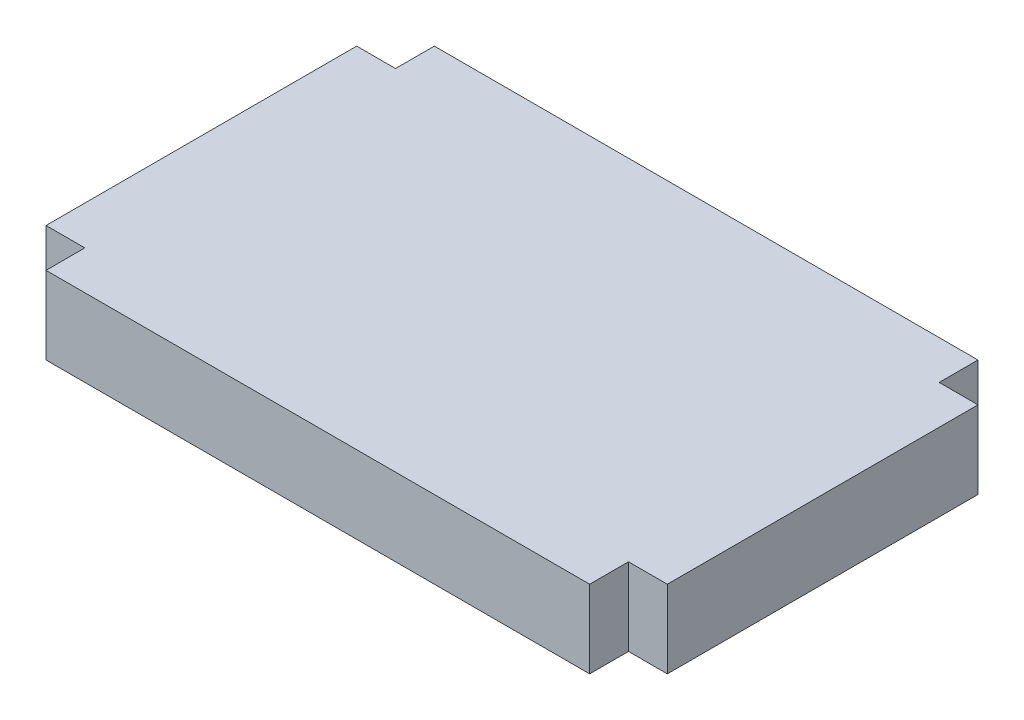
ISO-10303-21;
HEADER;
FILE_DESCRIPTION(('STEP AP214'),'2;1');
FILE_NAME('part.step','',(''),(''),'','','');
FILE_SCHEMA(('AUTOMOTIVE_DESIGN { 1 0 10303 214 1 1 1 1 }'));
ENDSEC;
DATA;
#1=APPLICATION_CONTEXT('core data for automotive mechanical design processes');
#2=APPLICATION_PROTOCOL_DEFINITION('international standard','automotive_design',2000,#1);
#3=PRODUCT_CONTEXT('',#1,'mechanical');
#4=PRODUCT('Part','Part','',(#3));
#5=PRODUCT_RELATED_PRODUCT_CATEGORY('part','',(#4));
#6=PRODUCT_DEFINITION_FORMATION('','',#4);
#7=PRODUCT_DEFINITION_CONTEXT('part definition',#1,'design');
#8=PRODUCT_DEFINITION('design','',#6,#7);
#9=PRODUCT_DEFINITION_SHAPE('','',#8);
#10=(LENGTH_UNIT() NAMED_UNIT(*) SI_UNIT(.MILLI.,.METRE.));
#11=(NAMED_UNIT(*) PLANE_ANGLE_UNIT() SI_UNIT($,.RADIAN.));
#12=(NAMED_UNIT(*) SI_UNIT($,.STERADIAN.) SOLID_ANGLE_UNIT());
#13=UNCERTAINTY_MEASURE_WITH_UNIT(LENGTH_MEASURE(1.E-05),#10,'distance_accuracy_value','');
#14=(GEOMETRIC_REPRESENTATION_CONTEXT(3) GLOBAL_UNCERTAINTY_ASSIGNED_CONTEXT((#13)) GLOBAL_UNIT_ASSIGNED_CONTEXT((#10,
#11,#12)) REPRESENTATION_CONTEXT('',''));
#15=CARTESIAN_POINT('',(0.,0.,0.));
#16=DIRECTION('',(0.,0.,1.));
#17=DIRECTION('',(1.,0.,0.));
#18=AXIS2_PLACEMENT_3D('',#15,#16,#17);
#19=CARTESIAN_POINT('',(22.225,6.35,12.7));
#20=DIRECTION('',(0.,0.,-1.));
#21=DIRECTION('',(-1.,0.,0.));
#22=AXIS2_PLACEMENT_3D('',#19,#20,#21);
#23=PLANE('',#22);
#24=DIRECTION('',(1.,0.,0.));
#25=VECTOR('',#24,1.);
#26=CARTESIAN_POINT('',(22.225,0.,12.7));
#27=LINE('',#26,#25);
#28=CARTESIAN_POINT('',(22.225,0.,12.7));
#29=VERTEX_POINT('',#28);
#30=CARTESIAN_POINT('',(25.4,0.,12.7));
#31=VERTEX_POINT('',#30);
#32=EDGE_CURVE('E164',#29,#31,#27,.T.);
#33=ORIENTED_EDGE('',*,*,#32,.T.);
#34=DIRECTION('',(0.,-1.,0.));
#35=VECTOR('',#34,1.);
#36=CARTESIAN_POINT('',(25.4,6.35,12.7));
#37=LINE('',#36,#35);
#38=CARTESIAN_POINT('',(25.4,6.35,12.7));
#39=VERTEX_POINT('',#38);
#40=EDGE_CURVE('E11',#39,#31,#37,.T.);
#41=ORIENTED_EDGE('',*,*,#40,.F.);
#42=DIRECTION('',(1.,0.,0.));
#43=VECTOR('',#42,1.);
#44=CARTESIAN_POINT('',(22.225,6.35,12.7));
#45=LINE('',#44,#43);
#46=CARTESIAN_POINT('',(22.225,6.35,12.7));
#47=VERTEX_POINT('',#46);
#48=EDGE_CURVE('E198',#47,#39,#45,.T.);
#49=ORIENTED_EDGE('',*,*,#48,.F.);
#50=DIRECTION('',(0.,-1.,0.));
#51=VECTOR('',#50,1.);
#52=CARTESIAN_POINT('',(22.225,6.35,12.7));
#53=LINE('',#52,#51);
#54=EDGE_CURVE('E160',#47,#29,#53,.T.);
#55=ORIENTED_EDGE('',*,*,#54,.T.);
#56=EDGE_LOOP('',(#33,#41,#49,#55));
#57=FACE_BOUND('',#56,.T.);
#58=ADVANCED_FACE('F39',(#57),#23,.F.);
#59=CARTESIAN_POINT('',(25.4,6.35,-12.7));
#60=DIRECTION('',(-1.,0.,0.));
#61=DIRECTION('',(0.,0.,1.));
#62=AXIS2_PLACEMENT_3D('',#59,#60,#61);
#63=PLANE('',#62);
#64=DIRECTION('',(0.,0.,-1.));
#65=VECTOR('',#64,1.);
#66=CARTESIAN_POINT('',(25.4,0.,-12.7));
#67=LINE('',#66,#65);
#68=CARTESIAN_POINT('',(25.4,0.,-12.7));
#69=VERTEX_POINT('',#68);
#70=EDGE_CURVE('E168',#31,#69,#67,.T.);
#71=ORIENTED_EDGE('',*,*,#70,.T.);
#72=DIRECTION('',(0.,-1.,0.));
#73=VECTOR('',#72,1.);
#74=CARTESIAN_POINT('',(25.4,6.35,-12.7));
#75=LINE('',#74,#73);
#76=CARTESIAN_POINT('',(25.4,6.35,-12.7));
#77=VERTEX_POINT('',#76);
#78=EDGE_CURVE('E48',#77,#69,#75,.T.);
#79=ORIENTED_EDGE('',*,*,#78,.F.);
#80=DIRECTION('',(0.,0.,-1.));
#81=VECTOR('',#80,1.);
#82=CARTESIAN_POINT('',(25.4,6.35,-12.7));
#83=LINE('',#82,#81);
#84=EDGE_CURVE('E111',#39,#77,#83,.T.);
#85=ORIENTED_EDGE('',*,*,#84,.F.);
#86=ORIENTED_EDGE('',*,*,#40,.T.);
#87=EDGE_LOOP('',(#71,#79,#85,#86));
#88=FACE_BOUND('',#87,.T.);
#89=ADVANCED_FACE('F292',(#88),#63,.F.);
#90=CARTESIAN_POINT('',(22.225,6.35,-12.7));
#91=DIRECTION('',(0.,0.,1.));
#92=DIRECTION('',(1.,0.,0.));
#93=AXIS2_PLACEMENT_3D('',#90,#91,#92);
#94=PLANE('',#93);
#95=DIRECTION('',(-1.,0.,0.));
#96=VECTOR('',#95,1.);
#97=CARTESIAN_POINT('',(22.225,0.,-12.7));
#98=LINE('',#97,#96);
#99=CARTESIAN_POINT('',(22.225,0.,-12.7));
#100=VERTEX_POINT('',#99);
#101=EDGE_CURVE('E171',#69,#100,#98,.T.);
#102=ORIENTED_EDGE('',*,*,#101,.T.);
#103=DIRECTION('',(0.,-1.,0.));
#104=VECTOR('',#103,1.);
#105=CARTESIAN_POINT('',(22.225,6.35,-12.7));
#106=LINE('',#105,#104);
#107=CARTESIAN_POINT('',(22.225,6.35,-12.7));
#108=VERTEX_POINT('',#107);
#109=EDGE_CURVE('E225',#108,#100,#106,.T.);
#110=ORIENTED_EDGE('',*,*,#109,.F.);
#111=DIRECTION('',(-1.,0.,0.));
#112=VECTOR('',#111,1.);
#113=CARTESIAN_POINT('',(22.225,6.35,-12.7));
#114=LINE('',#113,#112);
#115=EDGE_CURVE('E235',#77,#108,#114,.T.);
#116=ORIENTED_EDGE('',*,*,#115,.F.);
#117=ORIENTED_EDGE('',*,*,#78,.T.);
#118=EDGE_LOOP('',(#102,#110,#116,#117));
#119=FACE_BOUND('',#118,.T.);
#120=ADVANCED_FACE('F233',(#119),#94,.F.);
#121=CARTESIAN_POINT('',(22.225,6.35,-15.875));
#122=DIRECTION('',(-1.,0.,0.));
#123=DIRECTION('',(0.,0.,1.));
#124=AXIS2_PLACEMENT_3D('',#121,#122,#123);
#125=PLANE('',#124);
#126=DIRECTION('',(0.,0.,-1.));
#127=VECTOR('',#126,1.);
#128=CARTESIAN_POINT('',(22.225,0.,-15.875));
#129=LINE('',#128,#127);
#130=CARTESIAN_POINT('',(22.225,0.,-15.875));
#131=VERTEX_POINT('',#130);
#132=EDGE_CURVE('E174',#100,#131,#129,.T.);
#133=ORIENTED_EDGE('',*,*,#132,.T.);
#134=DIRECTION('',(0.,-1.,0.));
#135=VECTOR('',#134,1.);
#136=CARTESIAN_POINT('',(22.225,6.35,-15.875));
#137=LINE('',#136,#135);
#138=CARTESIAN_POINT('',(22.225,6.35,-15.875));
#139=VERTEX_POINT('',#138);
#140=EDGE_CURVE('E221',#139,#131,#137,.T.);
#141=ORIENTED_EDGE('',*,*,#140,.F.);
#142=DIRECTION('',(0.,0.,-1.));
#143=VECTOR('',#142,1.);
#144=CARTESIAN_POINT('',(22.225,6.35,-15.875));
#145=LINE('',#144,#143);
#146=EDGE_CURVE('E254',#108,#139,#145,.T.);
#147=ORIENTED_EDGE('',*,*,#146,.F.);
#148=ORIENTED_EDGE('',*,*,#109,.T.);
#149=EDGE_LOOP('',(#133,#141,#147,#148));
#150=FACE_BOUND('',#149,.T.);
#151=ADVANCED_FACE('F244',(#150),#125,.F.);
#152=CARTESIAN_POINT('',(-22.225,6.35,-15.875));
#153=DIRECTION('',(0.,0.,1.));
#154=DIRECTION('',(1.,0.,0.));
#155=AXIS2_PLACEMENT_3D('',#152,#153,#154);
#156=PLANE('',#155);
#157=DIRECTION('',(-1.,0.,0.));
#158=VECTOR('',#157,1.);
#159=CARTESIAN_POINT('',(-22.225,0.,-15.875));
#160=LINE('',#159,#158);
#161=CARTESIAN_POINT('',(-22.225,0.,-15.875));
#162=VERTEX_POINT('',#161);
#163=EDGE_CURVE('E177',#131,#162,#160,.T.);
#164=ORIENTED_EDGE('',*,*,#163,.T.);
#165=DIRECTION('',(0.,-1.,0.));
#166=VECTOR('',#165,1.);
#167=CARTESIAN_POINT('',(-22.225,6.35,-15.875));
#168=LINE('',#167,#166);
#169=CARTESIAN_POINT('',(-22.225,6.35,-15.875));
#170=VERTEX_POINT('',#169);
#171=EDGE_CURVE('E217',#170,#162,#168,.T.);
#172=ORIENTED_EDGE('',*,*,#171,.F.);
#173=DIRECTION('',(-1.,0.,0.));
#174=VECTOR('',#173,1.);
#175=CARTESIAN_POINT('',(-22.225,6.35,-15.875));
#176=LINE('',#175,#174);
#177=EDGE_CURVE('E250',#139,#170,#176,.T.);
#178=ORIENTED_EDGE('',*,*,#177,.F.);
#179=ORIENTED_EDGE('',*,*,#140,.T.);
#180=EDGE_LOOP('',(#164,#172,#178,#179));
#181=FACE_BOUND('',#180,.T.);
#182=ADVANCED_FACE('F248',(#181),#156,.F.);
#183=CARTESIAN_POINT('',(-22.225,6.35,-12.7));
#184=DIRECTION('',(1.,0.,0.));
#185=DIRECTION('',(0.,0.,-1.));
#186=AXIS2_PLACEMENT_3D('',#183,#184,#185);
#187=PLANE('',#186);
#188=DIRECTION('',(0.,0.,1.));
#189=VECTOR('',#188,1.);
#190=CARTESIAN_POINT('',(-22.225,0.,-12.7));
#191=LINE('',#190,#189);
#192=CARTESIAN_POINT('',(-22.225,0.,-12.7));
#193=VERTEX_POINT('',#192);
#194=EDGE_CURVE('E180',#162,#193,#191,.T.);
#195=ORIENTED_EDGE('',*,*,#194,.T.);
#196=DIRECTION('',(0.,-1.,0.));
#197=VECTOR('',#196,1.);
#198=CARTESIAN_POINT('',(-22.225,6.35,-12.7));
#199=LINE('',#198,#197);
#200=CARTESIAN_POINT('',(-22.225,6.35,-12.7));
#201=VERTEX_POINT('',#200);
#202=EDGE_CURVE('E213',#201,#193,#199,.T.);
#203=ORIENTED_EDGE('',*,*,#202,.F.);
#204=DIRECTION('',(0.,0.,1.));
#205=VECTOR('',#204,1.);
#206=CARTESIAN_POINT('',(-22.225,6.35,-12.7));
#207=LINE('',#206,#205);
#208=EDGE_CURVE('E253',#170,#201,#207,.T.);
#209=ORIENTED_EDGE('',*,*,#208,.F.);
#210=ORIENTED_EDGE('',*,*,#171,.T.);
#211=EDGE_LOOP('',(#195,#203,#209,#210));
#212=FACE_BOUND('',#211,.T.);
#213=ADVANCED_FACE('F305',(#212),#187,.F.);
#214=CARTESIAN_POINT('',(-25.4,6.35,-12.7));
#215=DIRECTION('',(0.,0.,1.));
#216=DIRECTION('',(1.,0.,0.));
#217=AXIS2_PLACEMENT_3D('',#214,#215,#216);
#218=PLANE('',#217);
#219=DIRECTION('',(-1.,0.,0.));
#220=VECTOR('',#219,1.);
#221=CARTESIAN_POINT('',(-25.4,0.,-12.7));
#222=LINE('',#221,#220);
#223=CARTESIAN_POINT('',(-25.4,0.,-12.7));
#224=VERTEX_POINT('',#223);
#225=EDGE_CURVE('E183',#193,#224,#222,.T.);
#226=ORIENTED_EDGE('',*,*,#225,.T.);
#227=DIRECTION('',(0.,-1.,0.));
#228=VECTOR('',#227,1.);
#229=CARTESIAN_POINT('',(-25.4,6.35,-12.7));
#230=LINE('',#229,#228);
#231=CARTESIAN_POINT('',(-25.4,6.35,-12.7));
#232=VERTEX_POINT('',#231);
#233=EDGE_CURVE('E209',#232,#224,#230,.T.);
#234=ORIENTED_EDGE('',*,*,#233,.F.);
#235=DIRECTION('',(-1.,0.,0.));
#236=VECTOR('',#235,1.);
#237=CARTESIAN_POINT('',(-25.4,6.35,-12.7));
#238=LINE('',#237,#236);
#239=EDGE_CURVE('E258',#201,#232,#238,.T.);
#240=ORIENTED_EDGE('',*,*,#239,.F.);
#241=ORIENTED_EDGE('',*,*,#202,.T.);
#242=EDGE_LOOP('',(#226,#234,#240,#241));
#243=FACE_BOUND('',#242,.T.);
#244=ADVANCED_FACE('F308',(#243),#218,.F.);
#245=CARTESIAN_POINT('',(-25.4,6.35,-12.7));
#246=DIRECTION('',(1.,0.,0.));
#247=DIRECTION('',(0.,0.,-1.));
#248=AXIS2_PLACEMENT_3D('',#245,#246,#247);
#249=PLANE('',#248);
#250=DIRECTION('',(0.,0.,1.));
#251=VECTOR('',#250,1.);
#252=CARTESIAN_POINT('',(-25.4,0.,-12.7));
#253=LINE('',#252,#251);
#254=CARTESIAN_POINT('',(-25.4,0.,12.7));
#255=VERTEX_POINT('',#254);
#256=EDGE_CURVE('E186',#224,#255,#253,.T.);
#257=ORIENTED_EDGE('',*,*,#256,.T.);
#258=DIRECTION('',(0.,-1.,0.));
#259=VECTOR('',#258,1.);
#260=CARTESIAN_POINT('',(-25.4,6.35,12.7));
#261=LINE('',#260,#259);
#262=CARTESIAN_POINT('',(-25.4,6.35,12.7));
#263=VERTEX_POINT('',#262);
#264=EDGE_CURVE('E205',#263,#255,#261,.T.);
#265=ORIENTED_EDGE('',*,*,#264,.F.);
#266=DIRECTION('',(0.,0.,1.));
#267=VECTOR('',#266,1.);
#268=CARTESIAN_POINT('',(-25.4,6.35,-12.7));
#269=LINE('',#268,#267);
#270=EDGE_CURVE('E265',#232,#263,#269,.T.);
#271=ORIENTED_EDGE('',*,*,#270,.F.);
#272=ORIENTED_EDGE('',*,*,#233,.T.);
#273=EDGE_LOOP('',(#257,#265,#271,#272));
#274=FACE_BOUND('',#273,.T.);
#275=ADVANCED_FACE('F273',(#274),#249,.F.);
#276=CARTESIAN_POINT('',(-25.4,6.35,12.7));
#277=DIRECTION('',(0.,0.,-1.));
#278=DIRECTION('',(-1.,0.,0.));
#279=AXIS2_PLACEMENT_3D('',#276,#277,#278);
#280=PLANE('',#279);
#281=DIRECTION('',(1.,0.,0.));
#282=VECTOR('',#281,1.);
#283=CARTESIAN_POINT('',(-25.4,0.,12.7));
#284=LINE('',#283,#282);
#285=CARTESIAN_POINT('',(-22.225,0.,12.7));
#286=VERTEX_POINT('',#285);
#287=EDGE_CURVE('E189',#255,#286,#284,.T.);
#288=ORIENTED_EDGE('',*,*,#287,.T.);
#289=DIRECTION('',(0.,-1.,0.));
#290=VECTOR('',#289,1.);
#291=CARTESIAN_POINT('',(-22.225,6.35,12.7));
#292=LINE('',#291,#290);
#293=CARTESIAN_POINT('',(-22.225,6.35,12.7));
#294=VERTEX_POINT('',#293);
#295=EDGE_CURVE('E153',#294,#286,#292,.T.);
#296=ORIENTED_EDGE('',*,*,#295,.F.);
#297=DIRECTION('',(1.,0.,0.));
#298=VECTOR('',#297,1.);
#299=CARTESIAN_POINT('',(-25.4,6.35,12.7));
#300=LINE('',#299,#298);
#301=EDGE_CURVE('E142',#263,#294,#300,.T.);
#302=ORIENTED_EDGE('',*,*,#301,.F.);
#303=ORIENTED_EDGE('',*,*,#264,.T.);
#304=EDGE_LOOP('',(#288,#296,#302,#303));
#305=FACE_BOUND('',#304,.T.);
#306=ADVANCED_FACE('F277',(#305),#280,.F.);
#307=CARTESIAN_POINT('',(-22.225,6.35,12.7));
#308=DIRECTION('',(1.,0.,0.));
#309=DIRECTION('',(0.,0.,-1.));
#310=AXIS2_PLACEMENT_3D('',#307,#308,#309);
#311=PLANE('',#310);
#312=DIRECTION('',(0.,0.,1.));
#313=VECTOR('',#312,1.);
#314=CARTESIAN_POINT('',(-22.225,0.,12.7));
#315=LINE('',#314,#313);
#316=CARTESIAN_POINT('',(-22.225,0.,15.875));
#317=VERTEX_POINT('',#316);
#318=EDGE_CURVE('E151',#286,#317,#315,.T.);
#319=ORIENTED_EDGE('',*,*,#318,.T.);
#320=DIRECTION('',(0.,-1.,0.));
#321=VECTOR('',#320,1.);
#322=CARTESIAN_POINT('',(-22.225,6.35,15.875));
#323=LINE('',#322,#321);
#324=CARTESIAN_POINT('',(-22.225,6.35,15.875));
#325=VERTEX_POINT('',#324);
#326=EDGE_CURVE('E148',#325,#317,#323,.T.);
#327=ORIENTED_EDGE('',*,*,#326,.F.);
#328=DIRECTION('',(0.,0.,1.));
#329=VECTOR('',#328,1.);
#330=CARTESIAN_POINT('',(-22.225,6.35,12.7));
#331=LINE('',#330,#329);
#332=EDGE_CURVE('E136',#294,#325,#331,.T.);
#333=ORIENTED_EDGE('',*,*,#332,.F.);
#334=ORIENTED_EDGE('',*,*,#295,.T.);
#335=EDGE_LOOP('',(#319,#327,#333,#334));
#336=FACE_BOUND('',#335,.T.);
#337=ADVANCED_FACE('F149',(#336),#311,.F.);
#338=CARTESIAN_POINT('',(-22.225,6.35,15.875));
#339=DIRECTION('',(0.,0.,-1.));
#340=DIRECTION('',(-1.,0.,0.));
#341=AXIS2_PLACEMENT_3D('',#338,#339,#340);
#342=PLANE('',#341);
#343=DIRECTION('',(1.,0.,0.));
#344=VECTOR('',#343,1.);
#345=CARTESIAN_POINT('',(-22.225,0.,15.875));
#346=LINE('',#345,#344);
#347=CARTESIAN_POINT('',(22.225,0.,15.875));
#348=VERTEX_POINT('',#347);
#349=EDGE_CURVE('E97',#317,#348,#346,.T.);
#350=ORIENTED_EDGE('',*,*,#349,.T.);
#351=DIRECTION('',(0.,-1.,0.));
#352=VECTOR('',#351,1.);
#353=CARTESIAN_POINT('',(22.225,6.35,15.875));
#354=LINE('',#353,#352);
#355=CARTESIAN_POINT('',(22.225,6.35,15.875));
#356=VERTEX_POINT('',#355);
#357=EDGE_CURVE('E154',#356,#348,#354,.T.);
#358=ORIENTED_EDGE('',*,*,#357,.F.);
#359=DIRECTION('',(1.,0.,0.));
#360=VECTOR('',#359,1.);
#361=CARTESIAN_POINT('',(-22.225,6.35,15.875));
#362=LINE('',#361,#360);
#363=EDGE_CURVE('E140',#325,#356,#362,.T.);
#364=ORIENTED_EDGE('',*,*,#363,.F.);
#365=ORIENTED_EDGE('',*,*,#326,.T.);
#366=EDGE_LOOP('',(#350,#358,#364,#365));
#367=FACE_BOUND('',#366,.T.);
#368=ADVANCED_FACE('F156',(#367),#342,.F.);
#369=CARTESIAN_POINT('',(22.225,6.35,15.875));
#370=DIRECTION('',(-1.,0.,0.));
#371=DIRECTION('',(0.,0.,1.));
#372=AXIS2_PLACEMENT_3D('',#369,#370,#371);
#373=PLANE('',#372);
#374=DIRECTION('',(0.,0.,-1.));
#375=VECTOR('',#374,1.);
#376=CARTESIAN_POINT('',(22.225,0.,15.875));
#377=LINE('',#376,#375);
#378=EDGE_CURVE('E103',#348,#29,#377,.T.);
#379=ORIENTED_EDGE('',*,*,#378,.T.);
#380=ORIENTED_EDGE('',*,*,#54,.F.);
#381=DIRECTION('',(0.,0.,-1.));
#382=VECTOR('',#381,1.);
#383=CARTESIAN_POINT('',(22.225,6.35,15.875));
#384=LINE('',#383,#382);
#385=EDGE_CURVE('E56',#356,#47,#384,.T.);
#386=ORIENTED_EDGE('',*,*,#385,.F.);
#387=ORIENTED_EDGE('',*,*,#357,.T.);
#388=EDGE_LOOP('',(#379,#380,#386,#387));
#389=FACE_BOUND('',#388,.T.);
#390=ADVANCED_FACE('F281',(#389),#373,.F.);
#391=CARTESIAN_POINT('',(0.,6.35,0.));
#392=DIRECTION('',(0.,-1.,0.));
#393=DIRECTION('',(0.,0.,-1.));
#394=AXIS2_PLACEMENT_3D('',#391,#392,#393);
#395=PLANE('',#394);
#396=ORIENTED_EDGE('',*,*,#48,.T.);
#397=ORIENTED_EDGE('',*,*,#84,.T.);
#398=ORIENTED_EDGE('',*,*,#115,.T.);
#399=ORIENTED_EDGE('',*,*,#146,.T.);
#400=ORIENTED_EDGE('',*,*,#177,.T.);
#401=ORIENTED_EDGE('',*,*,#208,.T.);
#402=ORIENTED_EDGE('',*,*,#239,.T.);
#403=ORIENTED_EDGE('',*,*,#270,.T.);
#404=ORIENTED_EDGE('',*,*,#301,.T.);
#405=ORIENTED_EDGE('',*,*,#332,.T.);
#406=ORIENTED_EDGE('',*,*,#363,.T.);
#407=ORIENTED_EDGE('',*,*,#385,.T.);
#408=EDGE_LOOP('',(#396,#397,#398,#399,#400,#401,#402,#403,#404,#405,#406,#407));
#409=FACE_BOUND('',#408,.T.);
#410=ADVANCED_FACE('F138',(#409),#395,.F.);
#411=CARTESIAN_POINT('',(0.,0.,0.));
#412=DIRECTION('',(0.,-1.,0.));
#413=DIRECTION('',(0.,0.,-1.));
#414=AXIS2_PLACEMENT_3D('',#411,#412,#413);
#415=PLANE('',#414);
#416=ORIENTED_EDGE('',*,*,#32,.F.);
#417=ORIENTED_EDGE('',*,*,#378,.F.);
#418=ORIENTED_EDGE('',*,*,#349,.F.);
#419=ORIENTED_EDGE('',*,*,#318,.F.);
#420=ORIENTED_EDGE('',*,*,#287,.F.);
#421=ORIENTED_EDGE('',*,*,#256,.F.);
#422=ORIENTED_EDGE('',*,*,#225,.F.);
#423=ORIENTED_EDGE('',*,*,#194,.F.);
#424=ORIENTED_EDGE('',*,*,#163,.F.);
#425=ORIENTED_EDGE('',*,*,#132,.F.);
#426=ORIENTED_EDGE('',*,*,#101,.F.);
#427=ORIENTED_EDGE('',*,*,#70,.F.);
#428=EDGE_LOOP('',(#416,#417,#418,#419,#420,#421,#422,#423,#424,#425,#426,#427));
#429=FACE_BOUND('',#428,.T.);
#430=ADVANCED_FACE('F239',(#429),#415,.T.);
#431=CLOSED_SHELL('',(#58,#89,#120,#151,#182,#213,#244,#275,#306,#337,#368,#390,#410,#430));
#432=MANIFOLD_SOLID_BREP('B2',#431);
#433=ADVANCED_BREP_SHAPE_REPRESENTATION('',(#18,#432),#14);
#434=SHAPE_DEFINITION_REPRESENTATION(#9,#433);
ENDSEC;
END-ISO-10303-21;
